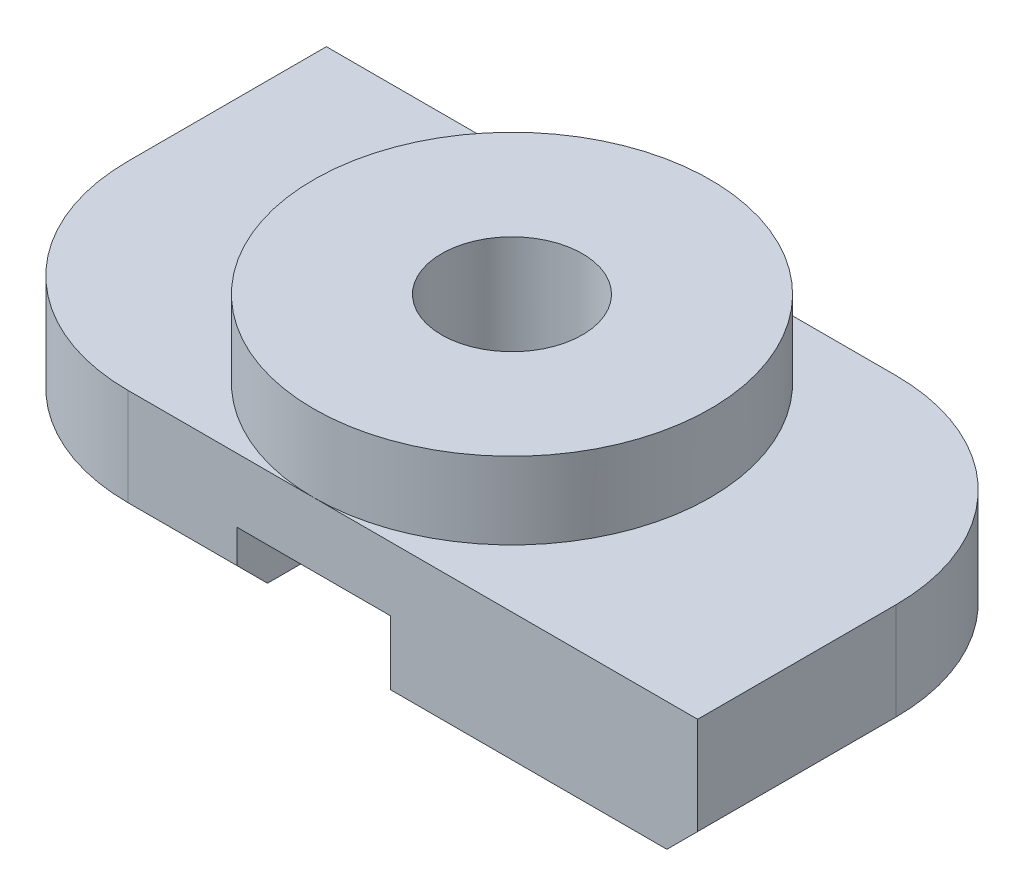
ISO-10303-21;
HEADER;
FILE_DESCRIPTION(('STEP AP214'),'2;1');
FILE_NAME('part.step','',(''),(''),'','','');
FILE_SCHEMA(('AUTOMOTIVE_DESIGN { 1 0 10303 214 1 1 1 1 }'));
ENDSEC;
DATA;
#1=APPLICATION_CONTEXT('core data for automotive mechanical design processes');
#2=APPLICATION_PROTOCOL_DEFINITION('international standard','automotive_design',2000,#1);
#3=PRODUCT_CONTEXT('',#1,'mechanical');
#4=PRODUCT('Part','Part','',(#3));
#5=PRODUCT_RELATED_PRODUCT_CATEGORY('part','',(#4));
#6=PRODUCT_DEFINITION_FORMATION('','',#4);
#7=PRODUCT_DEFINITION_CONTEXT('part definition',#1,'design');
#8=PRODUCT_DEFINITION('design','',#6,#7);
#9=PRODUCT_DEFINITION_SHAPE('','',#8);
#10=(LENGTH_UNIT() NAMED_UNIT(*) SI_UNIT(.MILLI.,.METRE.));
#11=(NAMED_UNIT(*) PLANE_ANGLE_UNIT() SI_UNIT($,.RADIAN.));
#12=(NAMED_UNIT(*) SI_UNIT($,.STERADIAN.) SOLID_ANGLE_UNIT());
#13=UNCERTAINTY_MEASURE_WITH_UNIT(LENGTH_MEASURE(1.E-05),#10,'distance_accuracy_value','');
#14=(GEOMETRIC_REPRESENTATION_CONTEXT(3) GLOBAL_UNCERTAINTY_ASSIGNED_CONTEXT((#13)) GLOBAL_UNIT_ASSIGNED_CONTEXT((#10,
#11,#12)) REPRESENTATION_CONTEXT('',''));
#15=CARTESIAN_POINT('',(0.,0.,0.));
#16=DIRECTION('',(0.,0.,1.));
#17=DIRECTION('',(1.,0.,0.));
#18=AXIS2_PLACEMENT_3D('',#15,#16,#17);
#19=CARTESIAN_POINT('',(0.,0.,0.));
#20=DIRECTION('',(0.,-1.,0.));
#21=DIRECTION('',(0.,0.,-1.));
#22=AXIS2_PLACEMENT_3D('',#19,#20,#21);
#23=PLANE('',#22);
#24=DIRECTION('',(0.,0.,-1.));
#25=VECTOR('',#24,1.);
#26=CARTESIAN_POINT('',(6.09600000000001,0.,0.));
#27=LINE('',#26,#25);
#28=CARTESIAN_POINT('',(6.09600000000001,0.,-0.609599999999998));
#29=VERTEX_POINT('',#28);
#30=CARTESIAN_POINT('',(6.09600000000002,0.,-7.874));
#31=VERTEX_POINT('',#30);
#32=EDGE_CURVE('E149',#29,#31,#27,.T.);
#33=ORIENTED_EDGE('',*,*,#32,.F.);
#34=DIRECTION('',(-1.,0.,0.));
#35=VECTOR('',#34,1.);
#36=CARTESIAN_POINT('',(3.937,0.,-0.609599999999998));
#37=LINE('',#36,#35);
#38=CARTESIAN_POINT('',(3.937,0.,-0.609599999999998));
#39=VERTEX_POINT('',#38);
#40=EDGE_CURVE('E58',#29,#39,#37,.T.);
#41=ORIENTED_EDGE('',*,*,#40,.T.);
#42=CARTESIAN_POINT('',(3.937,0.,-3.937));
#43=DIRECTION('',(0.,-1.,0.));
#44=DIRECTION('',(0.,0.,-1.));
#45=AXIS2_PLACEMENT_3D('',#42,#43,#44);
#46=CIRCLE('',#45,3.3274);
#47=CARTESIAN_POINT('',(0.609599999999998,0.,-3.937));
#48=VERTEX_POINT('',#47);
#49=EDGE_CURVE('E259',#39,#48,#46,.T.);
#50=ORIENTED_EDGE('',*,*,#49,.T.);
#51=DIRECTION('',(0.,0.,-1.));
#52=VECTOR('',#51,1.);
#53=CARTESIAN_POINT('',(0.609599999999998,0.,-7.874));
#54=LINE('',#53,#52);
#55=CARTESIAN_POINT('',(0.609599999999998,0.,-7.874));
#56=VERTEX_POINT('',#55);
#57=EDGE_CURVE('E257',#48,#56,#54,.T.);
#58=ORIENTED_EDGE('',*,*,#57,.T.);
#59=DIRECTION('',(-1.,0.,0.));
#60=VECTOR('',#59,1.);
#61=CARTESIAN_POINT('',(0.,0.,-7.874));
#62=LINE('',#61,#60);
#63=EDGE_CURVE('E202',#31,#56,#62,.T.);
#64=ORIENTED_EDGE('',*,*,#63,.F.);
#65=EDGE_LOOP('',(#33,#41,#50,#58,#64));
#66=FACE_BOUND('',#65,.T.);
#67=ADVANCED_FACE('F35',(#66),#23,.T.);
#68=CARTESIAN_POINT('',(7.62000000000002,0.,-3.937));
#69=DIRECTION('',(0.,1.,0.));
#70=DIRECTION('',(0.,0.,1.));
#71=AXIS2_PLACEMENT_3D('',#68,#69,#70);
#72=CYLINDRICAL_SURFACE('',#71,1.397);
#73=CARTESIAN_POINT('',(7.62000000000002,4.064,-3.937));
#74=DIRECTION('',(0.,1.,0.));
#75=DIRECTION('',(0.,0.,1.));
#76=AXIS2_PLACEMENT_3D('',#73,#74,#75);
#77=CIRCLE('',#76,1.397);
#78=CARTESIAN_POINT('',(7.62000000000002,4.064,-2.54));
#79=VERTEX_POINT('',#78);
#80=EDGE_CURVE('E187',#79,#79,#77,.T.);
#81=ORIENTED_EDGE('',*,*,#80,.T.);
#82=EDGE_LOOP('',(#81));
#83=FACE_BOUND('',#82,.T.);
#84=CARTESIAN_POINT('',(7.62000000000002,1.27,-3.937));
#85=DIRECTION('',(0.,-1.,0.));
#86=DIRECTION('',(0.,0.,-1.));
#87=AXIS2_PLACEMENT_3D('',#84,#85,#86);
#88=CIRCLE('',#87,1.397);
#89=CARTESIAN_POINT('',(7.62000000000002,1.27,-5.334));
#90=VERTEX_POINT('',#89);
#91=EDGE_CURVE('E182',#90,#90,#88,.F.);
#92=ORIENTED_EDGE('',*,*,#91,.F.);
#93=EDGE_LOOP('',(#92));
#94=FACE_BOUND('',#93,.T.);
#95=ADVANCED_FACE('F340',(#83,#94),#72,.F.);
#96=CARTESIAN_POINT('',(0.,2.54,0.));
#97=DIRECTION('',(0.,-1.,0.));
#98=DIRECTION('',(0.,0.,-1.));
#99=AXIS2_PLACEMENT_3D('',#96,#97,#98);
#100=PLANE('',#99);
#101=DIRECTION('',(0.,0.,-1.));
#102=VECTOR('',#101,1.);
#103=CARTESIAN_POINT('',(15.24,2.54,0.));
#104=LINE('',#103,#102);
#105=CARTESIAN_POINT('',(15.24,2.54,0.));
#106=VERTEX_POINT('',#105);
#107=CARTESIAN_POINT('',(15.24,2.54,-3.937));
#108=VERTEX_POINT('',#107);
#109=EDGE_CURVE('E205',#106,#108,#104,.T.);
#110=ORIENTED_EDGE('',*,*,#109,.T.);
#111=CARTESIAN_POINT('',(11.303,2.54,-3.937));
#112=DIRECTION('',(0.,-1.,0.));
#113=DIRECTION('',(0.,0.,-1.));
#114=AXIS2_PLACEMENT_3D('',#111,#112,#113);
#115=CIRCLE('',#114,3.937);
#116=CARTESIAN_POINT('',(11.303,2.54,-7.874));
#117=VERTEX_POINT('',#116);
#118=EDGE_CURVE('E223',#108,#117,#115,.F.);
#119=ORIENTED_EDGE('',*,*,#118,.T.);
#120=DIRECTION('',(-1.,0.,0.));
#121=VECTOR('',#120,1.);
#122=CARTESIAN_POINT('',(0.,2.54,-7.874));
#123=LINE('',#122,#121);
#124=CARTESIAN_POINT('',(7.62000000000002,2.54,-7.874));
#125=VERTEX_POINT('',#124);
#126=EDGE_CURVE('E209',#117,#125,#123,.T.);
#127=ORIENTED_EDGE('',*,*,#126,.T.);
#128=CARTESIAN_POINT('',(7.62000000000002,2.54,-3.937));
#129=DIRECTION('',(0.,1.,0.));
#130=DIRECTION('',(0.,0.,1.));
#131=AXIS2_PLACEMENT_3D('',#128,#129,#130);
#132=CIRCLE('',#131,3.937);
#133=CARTESIAN_POINT('',(7.62000000000002,2.54,0.));
#134=VERTEX_POINT('',#133);
#135=EDGE_CURVE('E190',#134,#125,#132,.T.);
#136=ORIENTED_EDGE('',*,*,#135,.F.);
#137=DIRECTION('',(1.,0.,0.));
#138=VECTOR('',#137,1.);
#139=CARTESIAN_POINT('',(0.,2.54,0.));
#140=LINE('',#139,#138);
#141=EDGE_CURVE('E201',#134,#106,#140,.T.);
#142=ORIENTED_EDGE('',*,*,#141,.T.);
#143=EDGE_LOOP('',(#110,#119,#127,#136,#142));
#144=FACE_BOUND('',#143,.T.);
#145=ADVANCED_FACE('F322',(#144),#100,.F.);
#146=DIRECTION('',(0.,0.,1.));
#147=VECTOR('',#146,1.);
#148=CARTESIAN_POINT('',(0.,2.54,0.));
#149=LINE('',#148,#147);
#150=CARTESIAN_POINT('',(0.,2.54,-7.874));
#151=VERTEX_POINT('',#150);
#152=CARTESIAN_POINT('',(0.,2.54,-3.937));
#153=VERTEX_POINT('',#152);
#154=EDGE_CURVE('E198',#151,#153,#149,.T.);
#155=ORIENTED_EDGE('',*,*,#154,.T.);
#156=CARTESIAN_POINT('',(3.937,2.54,-3.937));
#157=DIRECTION('',(0.,-1.,0.));
#158=DIRECTION('',(0.,0.,-1.));
#159=AXIS2_PLACEMENT_3D('',#156,#157,#158);
#160=CIRCLE('',#159,3.937);
#161=CARTESIAN_POINT('',(3.937,2.54,0.));
#162=VERTEX_POINT('',#161);
#163=EDGE_CURVE('E230',#153,#162,#160,.F.);
#164=ORIENTED_EDGE('',*,*,#163,.T.);
#165=EDGE_CURVE('E203',#162,#134,#140,.T.);
#166=ORIENTED_EDGE('',*,*,#165,.T.);
#167=EDGE_CURVE('E197',#125,#134,#132,.T.);
#168=ORIENTED_EDGE('',*,*,#167,.F.);
#169=EDGE_CURVE('E208',#125,#151,#123,.T.);
#170=ORIENTED_EDGE('',*,*,#169,.T.);
#171=EDGE_LOOP('',(#155,#164,#166,#168,#170));
#172=FACE_BOUND('',#171,.T.);
#173=ADVANCED_FACE('F286',(#172),#100,.F.);
#174=CARTESIAN_POINT('',(0.,2.54,0.));
#175=DIRECTION('',(1.,0.,0.));
#176=DIRECTION('',(0.,0.,-1.));
#177=AXIS2_PLACEMENT_3D('',#174,#175,#176);
#178=PLANE('',#177);
#179=DIRECTION('',(0.,-1.,0.));
#180=VECTOR('',#179,1.);
#181=CARTESIAN_POINT('',(0.,2.54,-7.874));
#182=LINE('',#181,#180);
#183=CARTESIAN_POINT('',(0.,0.609599999999997,-7.874));
#184=VERTEX_POINT('',#183);
#185=EDGE_CURVE('E211',#151,#184,#182,.T.);
#186=ORIENTED_EDGE('',*,*,#185,.T.);
#187=DIRECTION('',(0.,0.,1.));
#188=VECTOR('',#187,1.);
#189=CARTESIAN_POINT('',(0.,0.609599999999997,-3.937));
#190=LINE('',#189,#188);
#191=CARTESIAN_POINT('',(0.,0.609599999999997,-3.937));
#192=VERTEX_POINT('',#191);
#193=EDGE_CURVE('E11',#184,#192,#190,.T.);
#194=ORIENTED_EDGE('',*,*,#193,.T.);
#195=DIRECTION('',(0.,-1.,0.));
#196=VECTOR('',#195,1.);
#197=CARTESIAN_POINT('',(0.,2.54,-3.937));
#198=LINE('',#197,#196);
#199=EDGE_CURVE('E228',#192,#153,#198,.F.);
#200=ORIENTED_EDGE('',*,*,#199,.T.);
#201=ORIENTED_EDGE('',*,*,#154,.F.);
#202=EDGE_LOOP('',(#186,#194,#200,#201));
#203=FACE_BOUND('',#202,.T.);
#204=ADVANCED_FACE('F283',(#203),#178,.F.);
#205=CARTESIAN_POINT('',(0.,2.54,0.));
#206=DIRECTION('',(0.,0.,-1.));
#207=DIRECTION('',(-1.,0.,0.));
#208=AXIS2_PLACEMENT_3D('',#205,#206,#207);
#209=PLANE('',#208);
#210=DIRECTION('',(1.,0.,0.));
#211=VECTOR('',#210,1.);
#212=CARTESIAN_POINT('',(0.,0.,0.));
#213=LINE('',#212,#211);
#214=CARTESIAN_POINT('',(9.14400000000002,0.,0.));
#215=VERTEX_POINT('',#214);
#216=CARTESIAN_POINT('',(14.6304,0.,0.));
#217=VERTEX_POINT('',#216);
#218=EDGE_CURVE('E194',#215,#217,#213,.T.);
#219=ORIENTED_EDGE('',*,*,#218,.T.);
#220=DIRECTION('',(0.707106781186549,0.707106781186547,0.));
#221=VECTOR('',#220,1.);
#222=CARTESIAN_POINT('',(15.24,0.609599999999997,0.));
#223=LINE('',#222,#221);
#224=CARTESIAN_POINT('',(15.24,0.609599999999997,0.));
#225=VERTEX_POINT('',#224);
#226=EDGE_CURVE('E253',#217,#225,#223,.T.);
#227=ORIENTED_EDGE('',*,*,#226,.T.);
#228=DIRECTION('',(0.,-1.,0.));
#229=VECTOR('',#228,1.);
#230=CARTESIAN_POINT('',(15.24,2.54,0.));
#231=LINE('',#230,#229);
#232=EDGE_CURVE('E216',#106,#225,#231,.T.);
#233=ORIENTED_EDGE('',*,*,#232,.F.);
#234=ORIENTED_EDGE('',*,*,#141,.F.);
#235=ORIENTED_EDGE('',*,*,#165,.F.);
#236=DIRECTION('',(0.,-1.,0.));
#237=VECTOR('',#236,1.);
#238=CARTESIAN_POINT('',(3.937,2.54,0.));
#239=LINE('',#238,#237);
#240=CARTESIAN_POINT('',(3.937,0.609599999999997,0.));
#241=VERTEX_POINT('',#240);
#242=EDGE_CURVE('E225',#162,#241,#239,.T.);
#243=ORIENTED_EDGE('',*,*,#242,.T.);
#244=DIRECTION('',(1.,0.,0.));
#245=VECTOR('',#244,1.);
#246=CARTESIAN_POINT('',(6.09600000000001,0.609599999999997,0.));
#247=LINE('',#246,#245);
#248=CARTESIAN_POINT('',(6.09600000000001,0.609599999999997,0.));
#249=VERTEX_POINT('',#248);
#250=EDGE_CURVE('E250',#241,#249,#247,.T.);
#251=ORIENTED_EDGE('',*,*,#250,.T.);
#252=DIRECTION('',(0.,-1.,0.));
#253=VECTOR('',#252,1.);
#254=CARTESIAN_POINT('',(6.09600000000001,1.27,0.));
#255=LINE('',#254,#253);
#256=CARTESIAN_POINT('',(6.09600000000001,1.27,0.));
#257=VERTEX_POINT('',#256);
#258=EDGE_CURVE('E180',#257,#249,#255,.T.);
#259=ORIENTED_EDGE('',*,*,#258,.F.);
#260=DIRECTION('',(-1.,0.,0.));
#261=VECTOR('',#260,1.);
#262=CARTESIAN_POINT('',(6.09600000000001,1.27,0.));
#263=LINE('',#262,#261);
#264=CARTESIAN_POINT('',(9.14400000000002,1.27,0.));
#265=VERTEX_POINT('',#264);
#266=EDGE_CURVE('E155',#265,#257,#263,.T.);
#267=ORIENTED_EDGE('',*,*,#266,.F.);
#268=DIRECTION('',(0.,-1.,0.));
#269=VECTOR('',#268,1.);
#270=CARTESIAN_POINT('',(9.14400000000002,1.27,0.));
#271=LINE('',#270,#269);
#272=EDGE_CURVE('E183',#265,#215,#271,.T.);
#273=ORIENTED_EDGE('',*,*,#272,.T.);
#274=EDGE_LOOP('',(#219,#227,#233,#234,#235,#243,#251,#259,#267,#273));
#275=FACE_BOUND('',#274,.T.);
#276=ADVANCED_FACE('F293',(#275),#209,.F.);
#277=CARTESIAN_POINT('',(15.24,2.54,0.));
#278=DIRECTION('',(-1.,0.,0.));
#279=DIRECTION('',(0.,0.,1.));
#280=AXIS2_PLACEMENT_3D('',#277,#278,#279);
#281=PLANE('',#280);
#282=ORIENTED_EDGE('',*,*,#232,.T.);
#283=DIRECTION('',(0.,0.,-1.));
#284=VECTOR('',#283,1.);
#285=CARTESIAN_POINT('',(15.24,0.609599999999997,-3.937));
#286=LINE('',#285,#284);
#287=CARTESIAN_POINT('',(15.24,0.609599999999997,-3.937));
#288=VERTEX_POINT('',#287);
#289=EDGE_CURVE('E248',#225,#288,#286,.T.);
#290=ORIENTED_EDGE('',*,*,#289,.T.);
#291=DIRECTION('',(0.,-1.,0.));
#292=VECTOR('',#291,1.);
#293=CARTESIAN_POINT('',(15.24,2.54,-3.937));
#294=LINE('',#293,#292);
#295=EDGE_CURVE('E221',#288,#108,#294,.F.);
#296=ORIENTED_EDGE('',*,*,#295,.T.);
#297=ORIENTED_EDGE('',*,*,#109,.F.);
#298=EDGE_LOOP('',(#282,#290,#296,#297));
#299=FACE_BOUND('',#298,.T.);
#300=ADVANCED_FACE('F349',(#299),#281,.F.);
#301=CARTESIAN_POINT('',(0.,2.54,-7.874));
#302=DIRECTION('',(0.,0.,1.));
#303=DIRECTION('',(1.,0.,0.));
#304=AXIS2_PLACEMENT_3D('',#301,#302,#303);
#305=PLANE('',#304);
#306=DIRECTION('',(0.,-1.,0.));
#307=VECTOR('',#306,1.);
#308=CARTESIAN_POINT('',(11.303,2.54,-7.874));
#309=LINE('',#308,#307);
#310=CARTESIAN_POINT('',(11.303,0.609599999999997,-7.874));
#311=VERTEX_POINT('',#310);
#312=EDGE_CURVE('E219',#117,#311,#309,.T.);
#313=ORIENTED_EDGE('',*,*,#312,.T.);
#314=DIRECTION('',(-1.,0.,0.));
#315=VECTOR('',#314,1.);
#316=CARTESIAN_POINT('',(9.14400000000001,0.609599999999997,-7.874));
#317=LINE('',#316,#315);
#318=CARTESIAN_POINT('',(9.14400000000002,0.609599999999997,-7.874));
#319=VERTEX_POINT('',#318);
#320=EDGE_CURVE('E236',#311,#319,#317,.T.);
#321=ORIENTED_EDGE('',*,*,#320,.T.);
#322=DIRECTION('',(0.,-1.,0.));
#323=VECTOR('',#322,1.);
#324=CARTESIAN_POINT('',(9.14400000000002,1.27,-7.874));
#325=LINE('',#324,#323);
#326=CARTESIAN_POINT('',(9.14400000000002,1.27,-7.874));
#327=VERTEX_POINT('',#326);
#328=EDGE_CURVE('E154',#327,#319,#325,.T.);
#329=ORIENTED_EDGE('',*,*,#328,.F.);
#330=DIRECTION('',(1.,0.,0.));
#331=VECTOR('',#330,1.);
#332=CARTESIAN_POINT('',(6.09600000000002,1.27,-7.874));
#333=LINE('',#332,#331);
#334=CARTESIAN_POINT('',(6.09600000000002,1.27,-7.874));
#335=VERTEX_POINT('',#334);
#336=EDGE_CURVE('E162',#335,#327,#333,.T.);
#337=ORIENTED_EDGE('',*,*,#336,.F.);
#338=DIRECTION('',(0.,-1.,0.));
#339=VECTOR('',#338,1.);
#340=CARTESIAN_POINT('',(6.09600000000002,1.27,-7.874));
#341=LINE('',#340,#339);
#342=EDGE_CURVE('E143',#335,#31,#341,.T.);
#343=ORIENTED_EDGE('',*,*,#342,.T.);
#344=ORIENTED_EDGE('',*,*,#63,.T.);
#345=DIRECTION('',(-0.707106781186549,0.707106781186547,0.));
#346=VECTOR('',#345,1.);
#347=CARTESIAN_POINT('',(0.,0.609599999999997,-7.874));
#348=LINE('',#347,#346);
#349=EDGE_CURVE('E232',#56,#184,#348,.T.);
#350=ORIENTED_EDGE('',*,*,#349,.T.);
#351=ORIENTED_EDGE('',*,*,#185,.F.);
#352=ORIENTED_EDGE('',*,*,#169,.F.);
#353=ORIENTED_EDGE('',*,*,#126,.F.);
#354=EDGE_LOOP('',(#313,#321,#329,#337,#343,#344,#350,#351,#352,#353));
#355=FACE_BOUND('',#354,.T.);
#356=ADVANCED_FACE('F169',(#355),#305,.F.);
#357=DIRECTION('',(0.,0.,1.));
#358=VECTOR('',#357,1.);
#359=CARTESIAN_POINT('',(9.14400000000002,0.,0.));
#360=LINE('',#359,#358);
#361=CARTESIAN_POINT('',(9.14400000000002,0.,-7.2644));
#362=VERTEX_POINT('',#361);
#363=EDGE_CURVE('E166',#362,#215,#360,.T.);
#364=ORIENTED_EDGE('',*,*,#363,.F.);
#365=DIRECTION('',(1.,0.,0.));
#366=VECTOR('',#365,1.);
#367=CARTESIAN_POINT('',(11.303,0.,-7.2644));
#368=LINE('',#367,#366);
#369=CARTESIAN_POINT('',(11.303,0.,-7.2644));
#370=VERTEX_POINT('',#369);
#371=EDGE_CURVE('E244',#362,#370,#368,.T.);
#372=ORIENTED_EDGE('',*,*,#371,.T.);
#373=CARTESIAN_POINT('',(11.303,0.,-3.937));
#374=DIRECTION('',(0.,-1.,0.));
#375=DIRECTION('',(0.,0.,-1.));
#376=AXIS2_PLACEMENT_3D('',#373,#374,#375);
#377=CIRCLE('',#376,3.3274);
#378=CARTESIAN_POINT('',(14.6304,0.,-3.937));
#379=VERTEX_POINT('',#378);
#380=EDGE_CURVE('E242',#370,#379,#377,.T.);
#381=ORIENTED_EDGE('',*,*,#380,.T.);
#382=DIRECTION('',(0.,0.,1.));
#383=VECTOR('',#382,1.);
#384=CARTESIAN_POINT('',(14.6304,0.,0.));
#385=LINE('',#384,#383);
#386=EDGE_CURVE('E240',#379,#217,#385,.T.);
#387=ORIENTED_EDGE('',*,*,#386,.T.);
#388=ORIENTED_EDGE('',*,*,#218,.F.);
#389=EDGE_LOOP('',(#364,#372,#381,#387,#388));
#390=FACE_BOUND('',#389,.T.);
#391=ADVANCED_FACE('F301',(#390),#23,.T.);
#392=CARTESIAN_POINT('',(7.62000000000002,4.064,-3.937));
#393=DIRECTION('',(0.,-1.,0.));
#394=DIRECTION('',(0.,0.,-1.));
#395=AXIS2_PLACEMENT_3D('',#392,#393,#394);
#396=CYLINDRICAL_SURFACE('',#395,3.937);
#397=CARTESIAN_POINT('',(7.62000000000002,4.064,-3.937));
#398=DIRECTION('',(0.,1.,0.));
#399=DIRECTION('',(0.,0.,1.));
#400=AXIS2_PLACEMENT_3D('',#397,#398,#399);
#401=CIRCLE('',#400,3.937);
#402=CARTESIAN_POINT('',(7.62000000000002,4.064,0.));
#403=VERTEX_POINT('',#402);
#404=EDGE_CURVE('E191',#403,#403,#401,.T.);
#405=ORIENTED_EDGE('',*,*,#404,.F.);
#406=EDGE_LOOP('',(#405));
#407=FACE_BOUND('',#406,.T.);
#408=ORIENTED_EDGE('',*,*,#135,.T.);
#409=ORIENTED_EDGE('',*,*,#167,.T.);
#410=EDGE_LOOP('',(#408,#409));
#411=FACE_BOUND('',#410,.T.);
#412=ADVANCED_FACE('F325',(#407,#411),#396,.T.);
#413=CARTESIAN_POINT('',(7.62000000000002,4.064,-3.937));
#414=DIRECTION('',(0.,1.,0.));
#415=DIRECTION('',(0.,0.,1.));
#416=AXIS2_PLACEMENT_3D('',#413,#414,#415);
#417=PLANE('',#416);
#418=ORIENTED_EDGE('',*,*,#80,.F.);
#419=EDGE_LOOP('',(#418));
#420=FACE_BOUND('',#419,.T.);
#421=ORIENTED_EDGE('',*,*,#404,.T.);
#422=EDGE_LOOP('',(#421));
#423=FACE_BOUND('',#422,.T.);
#424=ADVANCED_FACE('F327',(#420,#423),#417,.T.);
#425=CARTESIAN_POINT('',(11.303,2.54,-3.937));
#426=DIRECTION('',(0.,-1.,0.));
#427=DIRECTION('',(0.,0.,-1.));
#428=AXIS2_PLACEMENT_3D('',#425,#426,#427);
#429=CYLINDRICAL_SURFACE('',#428,3.937);
#430=ORIENTED_EDGE('',*,*,#295,.F.);
#431=CARTESIAN_POINT('',(11.303,0.609599999999997,-3.937));
#432=DIRECTION('',(0.,-1.,0.));
#433=DIRECTION('',(0.,0.,-1.));
#434=AXIS2_PLACEMENT_3D('',#431,#432,#433);
#435=CIRCLE('',#434,3.937);
#436=EDGE_CURVE('E246',#288,#311,#435,.F.);
#437=ORIENTED_EDGE('',*,*,#436,.T.);
#438=ORIENTED_EDGE('',*,*,#312,.F.);
#439=ORIENTED_EDGE('',*,*,#118,.F.);
#440=EDGE_LOOP('',(#430,#437,#438,#439));
#441=FACE_BOUND('',#440,.T.);
#442=ADVANCED_FACE('F317',(#441),#429,.T.);
#443=CARTESIAN_POINT('',(3.937,2.54,-3.937));
#444=DIRECTION('',(0.,-1.,0.));
#445=DIRECTION('',(0.,0.,-1.));
#446=AXIS2_PLACEMENT_3D('',#443,#444,#445);
#447=CYLINDRICAL_SURFACE('',#446,3.937);
#448=ORIENTED_EDGE('',*,*,#199,.F.);
#449=CARTESIAN_POINT('',(3.937,0.609599999999997,-3.937));
#450=DIRECTION('',(0.,-1.,0.));
#451=DIRECTION('',(0.,0.,-1.));
#452=AXIS2_PLACEMENT_3D('',#449,#450,#451);
#453=CIRCLE('',#452,3.937);
#454=EDGE_CURVE('E44',#192,#241,#453,.F.);
#455=ORIENTED_EDGE('',*,*,#454,.T.);
#456=ORIENTED_EDGE('',*,*,#242,.F.);
#457=ORIENTED_EDGE('',*,*,#163,.F.);
#458=EDGE_LOOP('',(#448,#455,#456,#457));
#459=FACE_BOUND('',#458,.T.);
#460=ADVANCED_FACE('F291',(#459),#447,.T.);
#461=CARTESIAN_POINT('',(0.,1.27,0.));
#462=DIRECTION('',(0.,-1.,0.));
#463=DIRECTION('',(0.,0.,-1.));
#464=AXIS2_PLACEMENT_3D('',#461,#462,#463);
#465=PLANE('',#464);
#466=DIRECTION('',(0.,0.,-1.));
#467=VECTOR('',#466,1.);
#468=CARTESIAN_POINT('',(6.09600000000001,1.27,0.));
#469=LINE('',#468,#467);
#470=EDGE_CURVE('E147',#257,#335,#469,.T.);
#471=ORIENTED_EDGE('',*,*,#470,.T.);
#472=ORIENTED_EDGE('',*,*,#336,.T.);
#473=DIRECTION('',(0.,0.,1.));
#474=VECTOR('',#473,1.);
#475=CARTESIAN_POINT('',(9.14400000000002,1.27,0.));
#476=LINE('',#475,#474);
#477=EDGE_CURVE('E172',#327,#265,#476,.T.);
#478=ORIENTED_EDGE('',*,*,#477,.T.);
#479=ORIENTED_EDGE('',*,*,#266,.T.);
#480=EDGE_LOOP('',(#471,#472,#478,#479));
#481=FACE_BOUND('',#480,.T.);
#482=ORIENTED_EDGE('',*,*,#91,.T.);
#483=EDGE_LOOP('',(#482));
#484=FACE_BOUND('',#483,.T.);
#485=ADVANCED_FACE('F159',(#481,#484),#465,.T.);
#486=CARTESIAN_POINT('',(6.09600000000001,1.27,0.));
#487=DIRECTION('',(-1.,0.,0.));
#488=DIRECTION('',(0.,0.,1.));
#489=AXIS2_PLACEMENT_3D('',#486,#487,#488);
#490=PLANE('',#489);
#491=ORIENTED_EDGE('',*,*,#258,.T.);
#492=DIRECTION('',(0.,-0.707106781186547,-0.707106781186549));
#493=VECTOR('',#492,1.);
#494=CARTESIAN_POINT('',(6.09600000000001,0.609599999999997,0.));
#495=LINE('',#494,#493);
#496=EDGE_CURVE('E255',#249,#29,#495,.T.);
#497=ORIENTED_EDGE('',*,*,#496,.T.);
#498=ORIENTED_EDGE('',*,*,#32,.T.);
#499=ORIENTED_EDGE('',*,*,#342,.F.);
#500=ORIENTED_EDGE('',*,*,#470,.F.);
#501=EDGE_LOOP('',(#491,#497,#498,#499,#500));
#502=FACE_BOUND('',#501,.T.);
#503=ADVANCED_FACE('F146',(#502),#490,.F.);
#504=CARTESIAN_POINT('',(9.14400000000002,1.27,0.));
#505=DIRECTION('',(1.,0.,0.));
#506=DIRECTION('',(0.,0.,-1.));
#507=AXIS2_PLACEMENT_3D('',#504,#505,#506);
#508=PLANE('',#507);
#509=ORIENTED_EDGE('',*,*,#328,.T.);
#510=DIRECTION('',(0.,-0.707106781186547,0.707106781186549));
#511=VECTOR('',#510,1.);
#512=CARTESIAN_POINT('',(9.14400000000002,0.609599999999997,-7.874));
#513=LINE('',#512,#511);
#514=EDGE_CURVE('E238',#319,#362,#513,.T.);
#515=ORIENTED_EDGE('',*,*,#514,.T.);
#516=ORIENTED_EDGE('',*,*,#363,.T.);
#517=ORIENTED_EDGE('',*,*,#272,.F.);
#518=ORIENTED_EDGE('',*,*,#477,.F.);
#519=EDGE_LOOP('',(#509,#515,#516,#517,#518));
#520=FACE_BOUND('',#519,.T.);
#521=ADVANCED_FACE('F369',(#520),#508,.F.);
#522=CARTESIAN_POINT('',(15.24,0.609599999999997,0.));
#523=DIRECTION('',(0.707106781186547,-0.707106781186549,0.));
#524=DIRECTION('',(0.,0.,1.));
#525=AXIS2_PLACEMENT_3D('',#522,#523,#524);
#526=PLANE('',#525);
#527=ORIENTED_EDGE('',*,*,#226,.F.);
#528=ORIENTED_EDGE('',*,*,#386,.F.);
#529=DIRECTION('',(-0.707106781186549,-0.707106781186547,0.));
#530=VECTOR('',#529,1.);
#531=CARTESIAN_POINT('',(15.24,0.609599999999997,-3.937));
#532=LINE('',#531,#530);
#533=EDGE_CURVE('E178',#288,#379,#532,.T.);
#534=ORIENTED_EDGE('',*,*,#533,.F.);
#535=ORIENTED_EDGE('',*,*,#289,.F.);
#536=EDGE_LOOP('',(#527,#528,#534,#535));
#537=FACE_BOUND('',#536,.T.);
#538=ADVANCED_FACE('F307',(#537),#526,.T.);
#539=CARTESIAN_POINT('',(11.303,0.,-3.937));
#540=DIRECTION('',(0.,1.,0.));
#541=DIRECTION('',(0.,0.,1.));
#542=AXIS2_PLACEMENT_3D('',#539,#540,#541);
#543=CONICAL_SURFACE('',#542,3.3274,0.78539816339745);
#544=ORIENTED_EDGE('',*,*,#533,.T.);
#545=ORIENTED_EDGE('',*,*,#380,.F.);
#546=DIRECTION('',(0.,-0.707106781186547,0.707106781186549));
#547=VECTOR('',#546,1.);
#548=CARTESIAN_POINT('',(11.303,0.609599999999997,-7.874));
#549=LINE('',#548,#547);
#550=EDGE_CURVE('E263',#311,#370,#549,.T.);
#551=ORIENTED_EDGE('',*,*,#550,.F.);
#552=ORIENTED_EDGE('',*,*,#436,.F.);
#553=EDGE_LOOP('',(#544,#545,#551,#552));
#554=FACE_BOUND('',#553,.T.);
#555=ADVANCED_FACE('F311',(#554),#543,.T.);
#556=CARTESIAN_POINT('',(0.,0.609599999999997,-7.874));
#557=DIRECTION('',(0.,-0.707106781186549,-0.707106781186547));
#558=DIRECTION('',(1.,0.,0.));
#559=AXIS2_PLACEMENT_3D('',#556,#557,#558);
#560=PLANE('',#559);
#561=ORIENTED_EDGE('',*,*,#550,.T.);
#562=ORIENTED_EDGE('',*,*,#371,.F.);
#563=ORIENTED_EDGE('',*,*,#514,.F.);
#564=ORIENTED_EDGE('',*,*,#320,.F.);
#565=EDGE_LOOP('',(#561,#562,#563,#564));
#566=FACE_BOUND('',#565,.T.);
#567=ADVANCED_FACE('F361',(#566),#560,.T.);
#568=CARTESIAN_POINT('',(0.,0.609599999999997,0.));
#569=DIRECTION('',(-0.707106781186547,-0.707106781186549,0.));
#570=DIRECTION('',(0.,0.,-1.));
#571=AXIS2_PLACEMENT_3D('',#568,#569,#570);
#572=PLANE('',#571);
#573=ORIENTED_EDGE('',*,*,#349,.F.);
#574=ORIENTED_EDGE('',*,*,#57,.F.);
#575=DIRECTION('',(0.707106781186549,-0.707106781186547,0.));
#576=VECTOR('',#575,1.);
#577=CARTESIAN_POINT('',(0.,0.609599999999997,-3.937));
#578=LINE('',#577,#576);
#579=EDGE_CURVE('E39',#192,#48,#578,.T.);
#580=ORIENTED_EDGE('',*,*,#579,.F.);
#581=ORIENTED_EDGE('',*,*,#193,.F.);
#582=EDGE_LOOP('',(#573,#574,#580,#581));
#583=FACE_BOUND('',#582,.T.);
#584=ADVANCED_FACE('F37',(#583),#572,.T.);
#585=CARTESIAN_POINT('',(3.937,0.,-3.937));
#586=DIRECTION('',(0.,1.,0.));
#587=DIRECTION('',(0.,0.,1.));
#588=AXIS2_PLACEMENT_3D('',#585,#586,#587);
#589=CONICAL_SURFACE('',#588,3.3274,0.78539816339745);
#590=ORIENTED_EDGE('',*,*,#579,.T.);
#591=ORIENTED_EDGE('',*,*,#49,.F.);
#592=DIRECTION('',(0.,-0.707106781186547,-0.707106781186549));
#593=VECTOR('',#592,1.);
#594=CARTESIAN_POINT('',(3.937,0.609599999999997,0.));
#595=LINE('',#594,#593);
#596=EDGE_CURVE('E267',#241,#39,#595,.T.);
#597=ORIENTED_EDGE('',*,*,#596,.F.);
#598=ORIENTED_EDGE('',*,*,#454,.F.);
#599=EDGE_LOOP('',(#590,#591,#597,#598));
#600=FACE_BOUND('',#599,.T.);
#601=ADVANCED_FACE('F276',(#600),#589,.T.);
#602=CARTESIAN_POINT('',(0.,0.609599999999997,0.));
#603=DIRECTION('',(0.,-0.707106781186549,0.707106781186547));
#604=DIRECTION('',(-1.,0.,0.));
#605=AXIS2_PLACEMENT_3D('',#602,#603,#604);
#606=PLANE('',#605);
#607=ORIENTED_EDGE('',*,*,#596,.T.);
#608=ORIENTED_EDGE('',*,*,#40,.F.);
#609=ORIENTED_EDGE('',*,*,#496,.F.);
#610=ORIENTED_EDGE('',*,*,#250,.F.);
#611=EDGE_LOOP('',(#607,#608,#609,#610));
#612=FACE_BOUND('',#611,.T.);
#613=ADVANCED_FACE('F295',(#612),#606,.T.);
#614=CLOSED_SHELL('',(#67,#95,#145,#173,#204,#276,#300,#356,#391,#412,#424,#442,#460,#485,#503,
#521,#538,#555,#567,#584,#601,#613));
#615=MANIFOLD_SOLID_BREP('B2',#614);
#616=ADVANCED_BREP_SHAPE_REPRESENTATION('',(#18,#615),#14);
#617=SHAPE_DEFINITION_REPRESENTATION(#9,#616);
ENDSEC;
END-ISO-10303-21;
